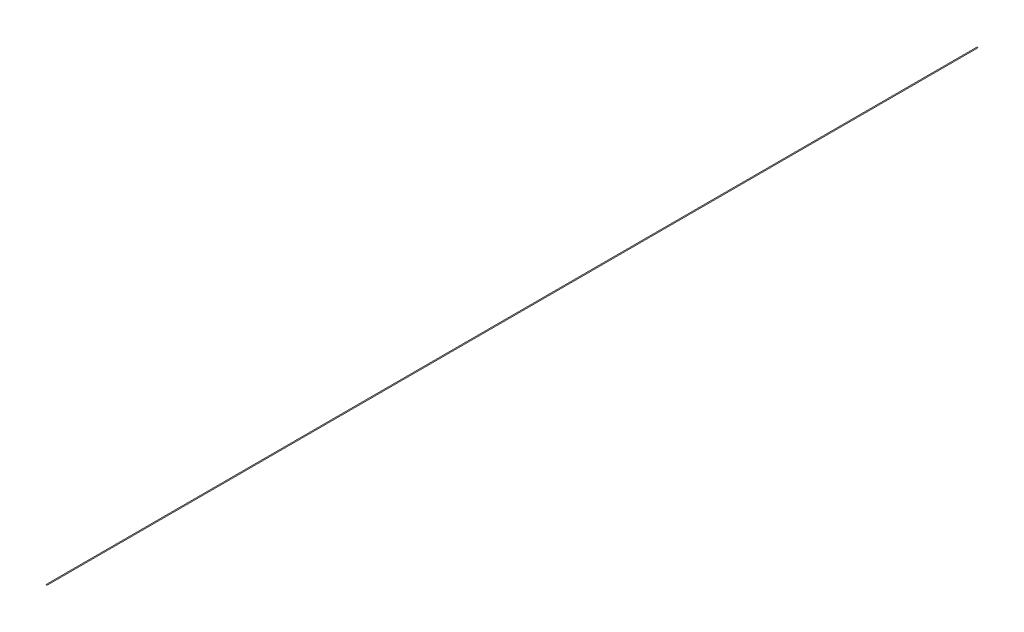
ISO-10303-21;
HEADER;
FILE_DESCRIPTION(('STEP AP214'),'2;1');
FILE_NAME('part.step','',(''),(''),'','','');
FILE_SCHEMA(('AUTOMOTIVE_DESIGN { 1 0 10303 214 1 1 1 1 }'));
ENDSEC;
DATA;
#1=APPLICATION_CONTEXT('core data for automotive mechanical design processes');
#2=APPLICATION_PROTOCOL_DEFINITION('international standard','automotive_design',2000,#1);
#3=PRODUCT_CONTEXT('',#1,'mechanical');
#4=PRODUCT('Part','Part','',(#3));
#5=PRODUCT_RELATED_PRODUCT_CATEGORY('part','',(#4));
#6=PRODUCT_DEFINITION_FORMATION('','',#4);
#7=PRODUCT_DEFINITION_CONTEXT('part definition',#1,'design');
#8=PRODUCT_DEFINITION('design','',#6,#7);
#9=PRODUCT_DEFINITION_SHAPE('','',#8);
#10=(LENGTH_UNIT() NAMED_UNIT(*) SI_UNIT(.MILLI.,.METRE.));
#11=(NAMED_UNIT(*) PLANE_ANGLE_UNIT() SI_UNIT($,.RADIAN.));
#12=(NAMED_UNIT(*) SI_UNIT($,.STERADIAN.) SOLID_ANGLE_UNIT());
#13=UNCERTAINTY_MEASURE_WITH_UNIT(LENGTH_MEASURE(1.E-05),#10,'distance_accuracy_value','');
#14=(GEOMETRIC_REPRESENTATION_CONTEXT(3) GLOBAL_UNCERTAINTY_ASSIGNED_CONTEXT((#13)) GLOBAL_UNIT_ASSIGNED_CONTEXT((#10,
#11,#12)) REPRESENTATION_CONTEXT('',''));
#15=CARTESIAN_POINT('',(0.,0.,0.));
#16=DIRECTION('',(0.,0.,1.));
#17=DIRECTION('',(1.,0.,0.));
#18=AXIS2_PLACEMENT_3D('',#15,#16,#17);
#19=CARTESIAN_POINT('',(30.,0.,50000.));
#20=DIRECTION('',(-0.755928794967557,-0.654653845126489,0.));
#21=DIRECTION('',(0.654653845126489,-0.755928794967557,0.));
#22=AXIS2_PLACEMENT_3D('',#19,#20,#21);
#23=PLANE('',#22);
#24=DIRECTION('',(-0.654653845126489,0.755928794967557,0.));
#25=VECTOR('',#24,1.);
#26=CARTESIAN_POINT('',(30.,0.,0.));
#27=LINE('',#26,#25);
#28=CARTESIAN_POINT('',(30.,0.,0.));
#29=VERTEX_POINT('',#28);
#30=CARTESIAN_POINT('',(0.,34.641,0.));
#31=VERTEX_POINT('',#30);
#32=EDGE_CURVE('E82',#29,#31,#27,.T.);
#33=ORIENTED_EDGE('',*,*,#32,.T.);
#34=DIRECTION('',(0.,0.,-1.));
#35=VECTOR('',#34,1.);
#36=CARTESIAN_POINT('',(0.,34.641,50000.));
#37=LINE('',#36,#35);
#38=CARTESIAN_POINT('',(0.,34.641,50000.));
#39=VERTEX_POINT('',#38);
#40=EDGE_CURVE('E11',#39,#31,#37,.T.);
#41=ORIENTED_EDGE('',*,*,#40,.F.);
#42=DIRECTION('',(-0.654653845126489,0.755928794967557,0.));
#43=VECTOR('',#42,1.);
#44=CARTESIAN_POINT('',(30.,0.,50000.));
#45=LINE('',#44,#43);
#46=CARTESIAN_POINT('',(30.,0.,50000.));
#47=VERTEX_POINT('',#46);
#48=EDGE_CURVE('E75',#47,#39,#45,.T.);
#49=ORIENTED_EDGE('',*,*,#48,.F.);
#50=DIRECTION('',(0.,0.,-1.));
#51=VECTOR('',#50,1.);
#52=CARTESIAN_POINT('',(30.,0.,50000.));
#53=LINE('',#52,#51);
#54=EDGE_CURVE('E83',#47,#29,#53,.T.);
#55=ORIENTED_EDGE('',*,*,#54,.T.);
#56=EDGE_LOOP('',(#33,#41,#49,#55));
#57=FACE_BOUND('',#56,.T.);
#58=ADVANCED_FACE('F35',(#57),#23,.F.);
#59=CARTESIAN_POINT('',(0.,34.641,50000.));
#60=DIRECTION('',(0.755928794967557,-0.654653845126489,0.));
#61=DIRECTION('',(0.654653845126489,0.755928794967557,0.));
#62=AXIS2_PLACEMENT_3D('',#59,#60,#61);
#63=PLANE('',#62);
#64=DIRECTION('',(-0.654653845126489,-0.755928794967557,0.));
#65=VECTOR('',#64,1.);
#66=CARTESIAN_POINT('',(0.,34.641,0.));
#67=LINE('',#66,#65);
#68=CARTESIAN_POINT('',(-30.,0.,0.));
#69=VERTEX_POINT('',#68);
#70=EDGE_CURVE('E63',#31,#69,#67,.T.);
#71=ORIENTED_EDGE('',*,*,#70,.T.);
#72=DIRECTION('',(0.,0.,-1.));
#73=VECTOR('',#72,1.);
#74=CARTESIAN_POINT('',(-30.,0.,50000.));
#75=LINE('',#74,#73);
#76=CARTESIAN_POINT('',(-30.,0.,50000.));
#77=VERTEX_POINT('',#76);
#78=EDGE_CURVE('E43',#77,#69,#75,.T.);
#79=ORIENTED_EDGE('',*,*,#78,.F.);
#80=DIRECTION('',(-0.654653845126489,-0.755928794967557,0.));
#81=VECTOR('',#80,1.);
#82=CARTESIAN_POINT('',(0.,34.641,50000.));
#83=LINE('',#82,#81);
#84=EDGE_CURVE('E71',#39,#77,#83,.T.);
#85=ORIENTED_EDGE('',*,*,#84,.F.);
#86=ORIENTED_EDGE('',*,*,#40,.T.);
#87=EDGE_LOOP('',(#71,#79,#85,#86));
#88=FACE_BOUND('',#87,.T.);
#89=ADVANCED_FACE('F72',(#88),#63,.F.);
#90=CARTESIAN_POINT('',(-30.,0.,50000.));
#91=DIRECTION('',(0.,1.,0.));
#92=DIRECTION('',(0.,0.,1.));
#93=AXIS2_PLACEMENT_3D('',#90,#91,#92);
#94=PLANE('',#93);
#95=DIRECTION('',(1.,0.,0.));
#96=VECTOR('',#95,1.);
#97=CARTESIAN_POINT('',(-30.,0.,0.));
#98=LINE('',#97,#96);
#99=EDGE_CURVE('E68',#69,#29,#98,.T.);
#100=ORIENTED_EDGE('',*,*,#99,.T.);
#101=ORIENTED_EDGE('',*,*,#54,.F.);
#102=DIRECTION('',(1.,0.,0.));
#103=VECTOR('',#102,1.);
#104=CARTESIAN_POINT('',(-30.,0.,50000.));
#105=LINE('',#104,#103);
#106=EDGE_CURVE('E51',#77,#47,#105,.T.);
#107=ORIENTED_EDGE('',*,*,#106,.F.);
#108=ORIENTED_EDGE('',*,*,#78,.T.);
#109=EDGE_LOOP('',(#100,#101,#107,#108));
#110=FACE_BOUND('',#109,.T.);
#111=ADVANCED_FACE('F90',(#110),#94,.F.);
#112=CARTESIAN_POINT('',(0.,0.,50000.));
#113=DIRECTION('',(0.,0.,1.));
#114=DIRECTION('',(1.,0.,0.));
#115=AXIS2_PLACEMENT_3D('',#112,#113,#114);
#116=PLANE('',#115);
#117=ORIENTED_EDGE('',*,*,#48,.T.);
#118=ORIENTED_EDGE('',*,*,#84,.T.);
#119=ORIENTED_EDGE('',*,*,#106,.T.);
#120=EDGE_LOOP('',(#117,#118,#119));
#121=FACE_BOUND('',#120,.T.);
#122=ADVANCED_FACE('F78',(#121),#116,.T.);
#123=CARTESIAN_POINT('',(0.,0.,0.));
#124=DIRECTION('',(0.,0.,1.));
#125=DIRECTION('',(1.,0.,0.));
#126=AXIS2_PLACEMENT_3D('',#123,#124,#125);
#127=PLANE('',#126);
#128=ORIENTED_EDGE('',*,*,#32,.F.);
#129=ORIENTED_EDGE('',*,*,#99,.F.);
#130=ORIENTED_EDGE('',*,*,#70,.F.);
#131=EDGE_LOOP('',(#128,#129,#130));
#132=FACE_BOUND('',#131,.T.);
#133=ADVANCED_FACE('F91',(#132),#127,.F.);
#134=CLOSED_SHELL('',(#58,#89,#111,#122,#133));
#135=MANIFOLD_SOLID_BREP('B2',#134);
#136=ADVANCED_BREP_SHAPE_REPRESENTATION('',(#18,#135),#14);
#137=SHAPE_DEFINITION_REPRESENTATION(#9,#136);
ENDSEC;
END-ISO-10303-21;
